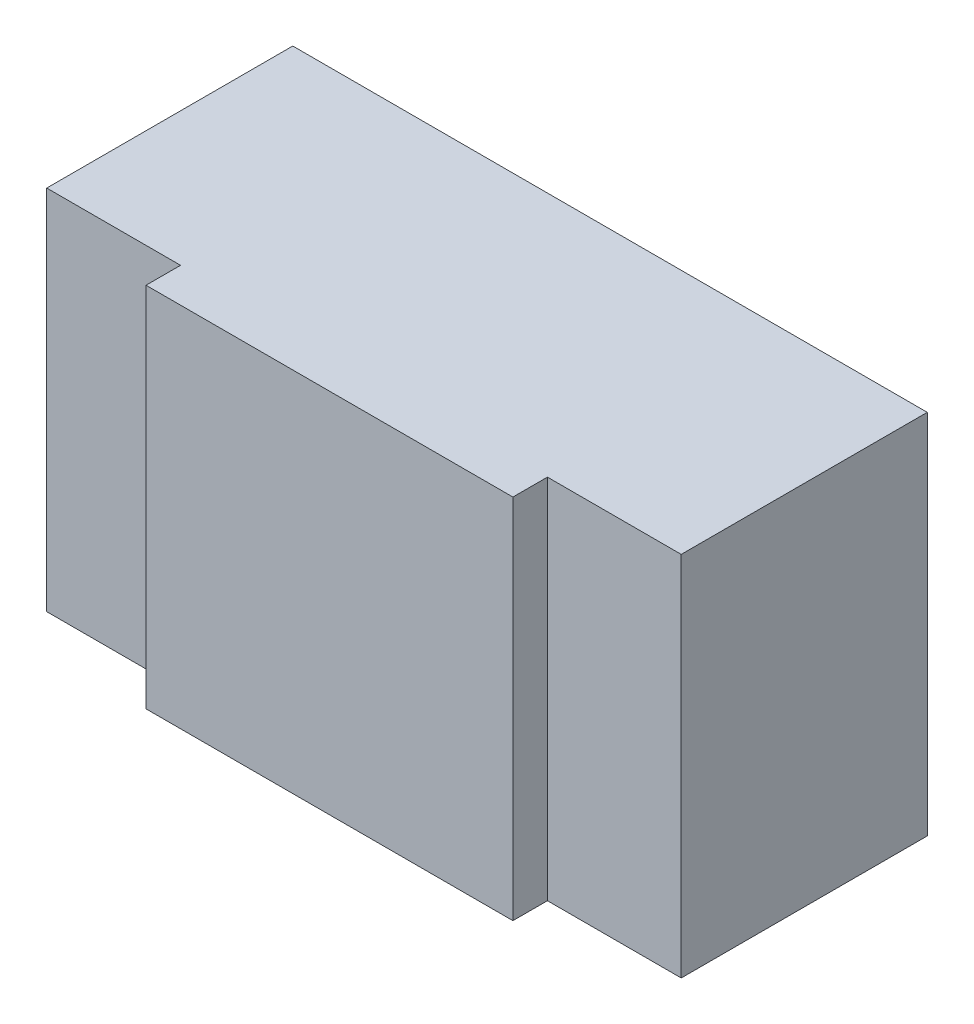
ISO-10303-21;
HEADER;
FILE_DESCRIPTION(('STEP AP214'),'2;1');
FILE_NAME('part.step','',(''),(''),'','','');
FILE_SCHEMA(('AUTOMOTIVE_DESIGN { 1 0 10303 214 1 1 1 1 }'));
ENDSEC;
DATA;
#1=APPLICATION_CONTEXT('core data for automotive mechanical design processes');
#2=APPLICATION_PROTOCOL_DEFINITION('international standard','automotive_design',2000,#1);
#3=PRODUCT_CONTEXT('',#1,'mechanical');
#4=PRODUCT('Part','Part','',(#3));
#5=PRODUCT_RELATED_PRODUCT_CATEGORY('part','',(#4));
#6=PRODUCT_DEFINITION_FORMATION('','',#4);
#7=PRODUCT_DEFINITION_CONTEXT('part definition',#1,'design');
#8=PRODUCT_DEFINITION('design','',#6,#7);
#9=PRODUCT_DEFINITION_SHAPE('','',#8);
#10=(LENGTH_UNIT() NAMED_UNIT(*) SI_UNIT(.MILLI.,.METRE.));
#11=(NAMED_UNIT(*) PLANE_ANGLE_UNIT() SI_UNIT($,.RADIAN.));
#12=(NAMED_UNIT(*) SI_UNIT($,.STERADIAN.) SOLID_ANGLE_UNIT());
#13=UNCERTAINTY_MEASURE_WITH_UNIT(LENGTH_MEASURE(1.E-05),#10,'distance_accuracy_value','');
#14=(GEOMETRIC_REPRESENTATION_CONTEXT(3) GLOBAL_UNCERTAINTY_ASSIGNED_CONTEXT((#13)) GLOBAL_UNIT_ASSIGNED_CONTEXT((#10,
#11,#12)) REPRESENTATION_CONTEXT('',''));
#15=CARTESIAN_POINT('',(0.,0.,0.));
#16=DIRECTION('',(0.,0.,1.));
#17=DIRECTION('',(1.,0.,0.));
#18=AXIS2_PLACEMENT_3D('',#15,#16,#17);
#19=CARTESIAN_POINT('',(-73.5,-42.5,57.));
#20=DIRECTION('',(1.,0.,0.));
#21=DIRECTION('',(0.,0.,-1.));
#22=AXIS2_PLACEMENT_3D('',#19,#20,#21);
#23=PLANE('',#22);
#24=DIRECTION('',(0.,-1.,0.));
#25=VECTOR('',#24,1.);
#26=CARTESIAN_POINT('',(-73.5,-42.5,0.));
#27=LINE('',#26,#25);
#28=CARTESIAN_POINT('',(-73.5,42.5,0.));
#29=VERTEX_POINT('',#28);
#30=CARTESIAN_POINT('',(-73.5,-42.5,0.));
#31=VERTEX_POINT('',#30);
#32=EDGE_CURVE('E195',#29,#31,#27,.T.);
#33=ORIENTED_EDGE('',*,*,#32,.T.);
#34=DIRECTION('',(0.,0.,-1.));
#35=VECTOR('',#34,1.);
#36=CARTESIAN_POINT('',(-73.5,-42.5,57.));
#37=LINE('',#36,#35);
#38=CARTESIAN_POINT('',(-73.5,-42.5,57.));
#39=VERTEX_POINT('',#38);
#40=EDGE_CURVE('E200',#39,#31,#37,.T.);
#41=ORIENTED_EDGE('',*,*,#40,.F.);
#42=DIRECTION('',(0.,-1.,0.));
#43=VECTOR('',#42,1.);
#44=CARTESIAN_POINT('',(-73.5,-42.5,57.));
#45=LINE('',#44,#43);
#46=CARTESIAN_POINT('',(-73.5,42.5,57.));
#47=VERTEX_POINT('',#46);
#48=EDGE_CURVE('E185',#47,#39,#45,.T.);
#49=ORIENTED_EDGE('',*,*,#48,.F.);
#50=DIRECTION('',(0.,0.,-1.));
#51=VECTOR('',#50,1.);
#52=CARTESIAN_POINT('',(-73.5,42.5,57.));
#53=LINE('',#52,#51);
#54=EDGE_CURVE('E43',#47,#29,#53,.T.);
#55=ORIENTED_EDGE('',*,*,#54,.T.);
#56=EDGE_LOOP('',(#33,#41,#49,#55));
#57=FACE_BOUND('',#56,.T.);
#58=DIRECTION('',(0.,-1.,0.));
#59=VECTOR('',#58,1.);
#60=CARTESIAN_POINT('',(-73.5,-4.5,30.));
#61=LINE('',#60,#59);
#62=CARTESIAN_POINT('',(-73.5,-4.5,30.));
#63=VERTEX_POINT('',#62);
#64=CARTESIAN_POINT('',(-73.5,-35.5,30.));
#65=VERTEX_POINT('',#64);
#66=EDGE_CURVE('E144',#63,#65,#61,.T.);
#67=ORIENTED_EDGE('',*,*,#66,.F.);
#68=DIRECTION('',(0.,0.,-1.));
#69=VECTOR('',#68,1.);
#70=CARTESIAN_POINT('',(-73.5,-4.5,30.));
#71=LINE('',#70,#69);
#72=CARTESIAN_POINT('',(-73.5,-4.5,54.));
#73=VERTEX_POINT('',#72);
#74=EDGE_CURVE('E141',#73,#63,#71,.T.);
#75=ORIENTED_EDGE('',*,*,#74,.F.);
#76=DIRECTION('',(0.,1.,0.));
#77=VECTOR('',#76,1.);
#78=CARTESIAN_POINT('',(-73.5,-4.5,54.));
#79=LINE('',#78,#77);
#80=CARTESIAN_POINT('',(-73.5,-35.5,54.));
#81=VERTEX_POINT('',#80);
#82=EDGE_CURVE('E55',#81,#73,#79,.T.);
#83=ORIENTED_EDGE('',*,*,#82,.F.);
#84=DIRECTION('',(0.,0.,1.));
#85=VECTOR('',#84,1.);
#86=CARTESIAN_POINT('',(-73.5,-35.5,30.));
#87=LINE('',#86,#85);
#88=EDGE_CURVE('E50',#65,#81,#87,.T.);
#89=ORIENTED_EDGE('',*,*,#88,.F.);
#90=EDGE_LOOP('',(#67,#75,#83,#89));
#91=FACE_BOUND('',#90,.T.);
#92=ADVANCED_FACE('F35',(#57,#91),#23,.F.);
#93=CARTESIAN_POINT('',(0.,0.,57.));
#94=DIRECTION('',(0.,0.,-1.));
#95=DIRECTION('',(-1.,0.,0.));
#96=AXIS2_PLACEMENT_3D('',#93,#94,#95);
#97=PLANE('',#96);
#98=DIRECTION('',(0.,-1.,0.));
#99=VECTOR('',#98,1.);
#100=CARTESIAN_POINT('',(-42.5,42.5,57.));
#101=LINE('',#100,#99);
#102=CARTESIAN_POINT('',(-42.5,42.5,57.));
#103=VERTEX_POINT('',#102);
#104=CARTESIAN_POINT('',(-42.5,-42.5,57.));
#105=VERTEX_POINT('',#104);
#106=EDGE_CURVE('E145',#103,#105,#101,.T.);
#107=ORIENTED_EDGE('',*,*,#106,.F.);
#108=DIRECTION('',(-1.,0.,0.));
#109=VECTOR('',#108,1.);
#110=CARTESIAN_POINT('',(-73.5,42.5,57.));
#111=LINE('',#110,#109);
#112=EDGE_CURVE('E181',#103,#47,#111,.T.);
#113=ORIENTED_EDGE('',*,*,#112,.T.);
#114=ORIENTED_EDGE('',*,*,#48,.T.);
#115=DIRECTION('',(1.,0.,0.));
#116=VECTOR('',#115,1.);
#117=CARTESIAN_POINT('',(-73.5,-42.5,57.));
#118=LINE('',#117,#116);
#119=EDGE_CURVE('E188',#39,#105,#118,.T.);
#120=ORIENTED_EDGE('',*,*,#119,.T.);
#121=EDGE_LOOP('',(#107,#113,#114,#120));
#122=FACE_BOUND('',#121,.T.);
#123=ADVANCED_FACE('F238',(#122),#97,.F.);
#124=DIRECTION('',(0.,1.,0.));
#125=VECTOR('',#124,1.);
#126=CARTESIAN_POINT('',(42.5,42.5,57.));
#127=LINE('',#126,#125);
#128=CARTESIAN_POINT('',(42.5,-42.5,57.));
#129=VERTEX_POINT('',#128);
#130=CARTESIAN_POINT('',(42.5,42.5,57.));
#131=VERTEX_POINT('',#130);
#132=EDGE_CURVE('E148',#129,#131,#127,.T.);
#133=ORIENTED_EDGE('',*,*,#132,.F.);
#134=CARTESIAN_POINT('',(73.5,-42.5,57.));
#135=VERTEX_POINT('',#134);
#136=EDGE_CURVE('E187',#129,#135,#118,.T.);
#137=ORIENTED_EDGE('',*,*,#136,.T.);
#138=DIRECTION('',(0.,1.,0.));
#139=VECTOR('',#138,1.);
#140=CARTESIAN_POINT('',(73.5,-42.5,57.));
#141=LINE('',#140,#139);
#142=CARTESIAN_POINT('',(73.5,42.5,57.));
#143=VERTEX_POINT('',#142);
#144=EDGE_CURVE('E178',#135,#143,#141,.T.);
#145=ORIENTED_EDGE('',*,*,#144,.T.);
#146=EDGE_CURVE('E183',#143,#131,#111,.T.);
#147=ORIENTED_EDGE('',*,*,#146,.T.);
#148=EDGE_LOOP('',(#133,#137,#145,#147));
#149=FACE_BOUND('',#148,.T.);
#150=ADVANCED_FACE('F223',(#149),#97,.F.);
#151=CARTESIAN_POINT('',(73.5,-42.5,57.));
#152=DIRECTION('',(-1.,0.,0.));
#153=DIRECTION('',(0.,0.,1.));
#154=AXIS2_PLACEMENT_3D('',#151,#152,#153);
#155=PLANE('',#154);
#156=DIRECTION('',(0.,1.,0.));
#157=VECTOR('',#156,1.);
#158=CARTESIAN_POINT('',(73.5,-42.5,0.));
#159=LINE('',#158,#157);
#160=CARTESIAN_POINT('',(73.5,-42.5,0.));
#161=VERTEX_POINT('',#160);
#162=CARTESIAN_POINT('',(73.5,42.5,0.));
#163=VERTEX_POINT('',#162);
#164=EDGE_CURVE('E177',#161,#163,#159,.T.);
#165=ORIENTED_EDGE('',*,*,#164,.T.);
#166=DIRECTION('',(0.,0.,-1.));
#167=VECTOR('',#166,1.);
#168=CARTESIAN_POINT('',(73.5,42.5,57.));
#169=LINE('',#168,#167);
#170=EDGE_CURVE('E11',#143,#163,#169,.T.);
#171=ORIENTED_EDGE('',*,*,#170,.F.);
#172=ORIENTED_EDGE('',*,*,#144,.F.);
#173=DIRECTION('',(0.,0.,-1.));
#174=VECTOR('',#173,1.);
#175=CARTESIAN_POINT('',(73.5,-42.5,57.));
#176=LINE('',#175,#174);
#177=EDGE_CURVE('E190',#135,#161,#176,.T.);
#178=ORIENTED_EDGE('',*,*,#177,.T.);
#179=EDGE_LOOP('',(#165,#171,#172,#178));
#180=FACE_BOUND('',#179,.T.);
#181=ADVANCED_FACE('F37',(#180),#155,.F.);
#182=CARTESIAN_POINT('',(-73.5,42.5,57.));
#183=DIRECTION('',(0.,-1.,0.));
#184=DIRECTION('',(0.,0.,-1.));
#185=AXIS2_PLACEMENT_3D('',#182,#183,#184);
#186=PLANE('',#185);
#187=DIRECTION('',(-1.,0.,0.));
#188=VECTOR('',#187,1.);
#189=CARTESIAN_POINT('',(-73.5,42.5,0.));
#190=LINE('',#189,#188);
#191=EDGE_CURVE('E193',#163,#29,#190,.T.);
#192=ORIENTED_EDGE('',*,*,#191,.T.);
#193=ORIENTED_EDGE('',*,*,#54,.F.);
#194=ORIENTED_EDGE('',*,*,#112,.F.);
#195=DIRECTION('',(0.,0.,-1.));
#196=VECTOR('',#195,1.);
#197=CARTESIAN_POINT('',(-42.5,42.5,65.));
#198=LINE('',#197,#196);
#199=CARTESIAN_POINT('',(-42.5,42.5,65.));
#200=VERTEX_POINT('',#199);
#201=EDGE_CURVE('E162',#200,#103,#198,.T.);
#202=ORIENTED_EDGE('',*,*,#201,.F.);
#203=DIRECTION('',(-1.,0.,0.));
#204=VECTOR('',#203,1.);
#205=CARTESIAN_POINT('',(-42.5,42.5,65.));
#206=LINE('',#205,#204);
#207=CARTESIAN_POINT('',(42.5,42.5,65.));
#208=VERTEX_POINT('',#207);
#209=EDGE_CURVE('E161',#208,#200,#206,.T.);
#210=ORIENTED_EDGE('',*,*,#209,.F.);
#211=DIRECTION('',(0.,0.,-1.));
#212=VECTOR('',#211,1.);
#213=CARTESIAN_POINT('',(42.5,42.5,65.));
#214=LINE('',#213,#212);
#215=EDGE_CURVE('E168',#208,#131,#214,.T.);
#216=ORIENTED_EDGE('',*,*,#215,.T.);
#217=ORIENTED_EDGE('',*,*,#146,.F.);
#218=ORIENTED_EDGE('',*,*,#170,.T.);
#219=EDGE_LOOP('',(#192,#193,#194,#202,#210,#216,#217,#218));
#220=FACE_BOUND('',#219,.T.);
#221=ADVANCED_FACE('F239',(#220),#186,.F.);
#222=CARTESIAN_POINT('',(-73.5,-42.5,57.));
#223=DIRECTION('',(0.,1.,0.));
#224=DIRECTION('',(0.,0.,1.));
#225=AXIS2_PLACEMENT_3D('',#222,#223,#224);
#226=PLANE('',#225);
#227=DIRECTION('',(1.,0.,0.));
#228=VECTOR('',#227,1.);
#229=CARTESIAN_POINT('',(-73.5,-42.5,0.));
#230=LINE('',#229,#228);
#231=EDGE_CURVE('E182',#31,#161,#230,.T.);
#232=ORIENTED_EDGE('',*,*,#231,.T.);
#233=ORIENTED_EDGE('',*,*,#177,.F.);
#234=ORIENTED_EDGE('',*,*,#136,.F.);
#235=DIRECTION('',(0.,0.,-1.));
#236=VECTOR('',#235,1.);
#237=CARTESIAN_POINT('',(42.5,-42.5,65.));
#238=LINE('',#237,#236);
#239=CARTESIAN_POINT('',(42.5,-42.5,65.));
#240=VERTEX_POINT('',#239);
#241=EDGE_CURVE('E171',#240,#129,#238,.T.);
#242=ORIENTED_EDGE('',*,*,#241,.F.);
#243=DIRECTION('',(1.,0.,0.));
#244=VECTOR('',#243,1.);
#245=CARTESIAN_POINT('',(-42.5,-42.5,65.));
#246=LINE('',#245,#244);
#247=CARTESIAN_POINT('',(-42.5,-42.5,65.));
#248=VERTEX_POINT('',#247);
#249=EDGE_CURVE('E157',#248,#240,#246,.T.);
#250=ORIENTED_EDGE('',*,*,#249,.F.);
#251=DIRECTION('',(0.,0.,-1.));
#252=VECTOR('',#251,1.);
#253=CARTESIAN_POINT('',(-42.5,-42.5,65.));
#254=LINE('',#253,#252);
#255=EDGE_CURVE('E174',#248,#105,#254,.T.);
#256=ORIENTED_EDGE('',*,*,#255,.T.);
#257=ORIENTED_EDGE('',*,*,#119,.F.);
#258=ORIENTED_EDGE('',*,*,#40,.T.);
#259=EDGE_LOOP('',(#232,#233,#234,#242,#250,#256,#257,#258));
#260=FACE_BOUND('',#259,.T.);
#261=ADVANCED_FACE('F216',(#260),#226,.F.);
#262=CARTESIAN_POINT('',(0.,0.,0.));
#263=DIRECTION('',(0.,0.,-1.));
#264=DIRECTION('',(-1.,0.,0.));
#265=AXIS2_PLACEMENT_3D('',#262,#263,#264);
#266=PLANE('',#265);
#267=ORIENTED_EDGE('',*,*,#164,.F.);
#268=ORIENTED_EDGE('',*,*,#231,.F.);
#269=ORIENTED_EDGE('',*,*,#32,.F.);
#270=ORIENTED_EDGE('',*,*,#191,.F.);
#271=EDGE_LOOP('',(#267,#268,#269,#270));
#272=FACE_BOUND('',#271,.T.);
#273=ADVANCED_FACE('F213',(#272),#266,.T.);
#274=CARTESIAN_POINT('',(-42.5,42.5,65.));
#275=DIRECTION('',(1.,0.,0.));
#276=DIRECTION('',(0.,1.,0.));
#277=AXIS2_PLACEMENT_3D('',#274,#275,#276);
#278=PLANE('',#277);
#279=ORIENTED_EDGE('',*,*,#106,.T.);
#280=ORIENTED_EDGE('',*,*,#255,.F.);
#281=DIRECTION('',(0.,-1.,0.));
#282=VECTOR('',#281,1.);
#283=CARTESIAN_POINT('',(-42.5,42.5,65.));
#284=LINE('',#283,#282);
#285=EDGE_CURVE('E154',#200,#248,#284,.T.);
#286=ORIENTED_EDGE('',*,*,#285,.F.);
#287=ORIENTED_EDGE('',*,*,#201,.T.);
#288=EDGE_LOOP('',(#279,#280,#286,#287));
#289=FACE_BOUND('',#288,.T.);
#290=ADVANCED_FACE('F236',(#289),#278,.F.);
#291=CARTESIAN_POINT('',(42.5,42.5,65.));
#292=DIRECTION('',(-1.,0.,0.));
#293=DIRECTION('',(0.,-1.,0.));
#294=AXIS2_PLACEMENT_3D('',#291,#292,#293);
#295=PLANE('',#294);
#296=ORIENTED_EDGE('',*,*,#132,.T.);
#297=ORIENTED_EDGE('',*,*,#215,.F.);
#298=DIRECTION('',(0.,1.,0.));
#299=VECTOR('',#298,1.);
#300=CARTESIAN_POINT('',(42.5,42.5,65.));
#301=LINE('',#300,#299);
#302=EDGE_CURVE('E159',#240,#208,#301,.T.);
#303=ORIENTED_EDGE('',*,*,#302,.F.);
#304=ORIENTED_EDGE('',*,*,#241,.T.);
#305=EDGE_LOOP('',(#296,#297,#303,#304));
#306=FACE_BOUND('',#305,.T.);
#307=ADVANCED_FACE('F227',(#306),#295,.F.);
#308=CARTESIAN_POINT('',(0.,0.,65.));
#309=DIRECTION('',(0.,0.,1.));
#310=DIRECTION('',(1.,0.,0.));
#311=AXIS2_PLACEMENT_3D('',#308,#309,#310);
#312=PLANE('',#311);
#313=ORIENTED_EDGE('',*,*,#285,.T.);
#314=ORIENTED_EDGE('',*,*,#249,.T.);
#315=ORIENTED_EDGE('',*,*,#302,.T.);
#316=ORIENTED_EDGE('',*,*,#209,.T.);
#317=EDGE_LOOP('',(#313,#314,#315,#316));
#318=FACE_BOUND('',#317,.T.);
#319=ADVANCED_FACE('F231',(#318),#312,.T.);
#320=CARTESIAN_POINT('',(-74.5,-4.5,30.));
#321=DIRECTION('',(0.,0.,1.));
#322=DIRECTION('',(0.,-1.,0.));
#323=AXIS2_PLACEMENT_3D('',#320,#321,#322);
#324=PLANE('',#323);
#325=ORIENTED_EDGE('',*,*,#66,.T.);
#326=DIRECTION('',(1.,0.,0.));
#327=VECTOR('',#326,1.);
#328=CARTESIAN_POINT('',(-74.5,-35.5,30.));
#329=LINE('',#328,#327);
#330=CARTESIAN_POINT('',(-74.5,-35.5,30.));
#331=VERTEX_POINT('',#330);
#332=EDGE_CURVE('E125',#331,#65,#329,.T.);
#333=ORIENTED_EDGE('',*,*,#332,.F.);
#334=DIRECTION('',(0.,-1.,0.));
#335=VECTOR('',#334,1.);
#336=CARTESIAN_POINT('',(-74.5,-4.5,30.));
#337=LINE('',#336,#335);
#338=CARTESIAN_POINT('',(-74.5,-4.5,30.));
#339=VERTEX_POINT('',#338);
#340=EDGE_CURVE('E132',#339,#331,#337,.T.);
#341=ORIENTED_EDGE('',*,*,#340,.F.);
#342=DIRECTION('',(1.,0.,0.));
#343=VECTOR('',#342,1.);
#344=CARTESIAN_POINT('',(-74.5,-4.5,30.));
#345=LINE('',#344,#343);
#346=EDGE_CURVE('E371',#339,#63,#345,.T.);
#347=ORIENTED_EDGE('',*,*,#346,.T.);
#348=EDGE_LOOP('',(#325,#333,#341,#347));
#349=FACE_BOUND('',#348,.T.);
#350=ADVANCED_FACE('F143',(#349),#324,.F.);
#351=CARTESIAN_POINT('',(-74.5,-35.5,30.));
#352=DIRECTION('',(0.,1.,0.));
#353=DIRECTION('',(0.,0.,1.));
#354=AXIS2_PLACEMENT_3D('',#351,#352,#353);
#355=PLANE('',#354);
#356=ORIENTED_EDGE('',*,*,#88,.T.);
#357=DIRECTION('',(1.,0.,0.));
#358=VECTOR('',#357,1.);
#359=CARTESIAN_POINT('',(-74.5,-35.5,54.));
#360=LINE('',#359,#358);
#361=CARTESIAN_POINT('',(-74.5,-35.5,54.));
#362=VERTEX_POINT('',#361);
#363=EDGE_CURVE('E128',#362,#81,#360,.T.);
#364=ORIENTED_EDGE('',*,*,#363,.F.);
#365=DIRECTION('',(0.,0.,1.));
#366=VECTOR('',#365,1.);
#367=CARTESIAN_POINT('',(-74.5,-35.5,30.));
#368=LINE('',#367,#366);
#369=EDGE_CURVE('E121',#331,#362,#368,.T.);
#370=ORIENTED_EDGE('',*,*,#369,.F.);
#371=ORIENTED_EDGE('',*,*,#332,.T.);
#372=EDGE_LOOP('',(#356,#364,#370,#371));
#373=FACE_BOUND('',#372,.T.);
#374=ADVANCED_FACE('F123',(#373),#355,.F.);
#375=CARTESIAN_POINT('',(-74.5,-4.5,54.));
#376=DIRECTION('',(0.,0.,-1.));
#377=DIRECTION('',(0.,1.,0.));
#378=AXIS2_PLACEMENT_3D('',#375,#376,#377);
#379=PLANE('',#378);
#380=ORIENTED_EDGE('',*,*,#82,.T.);
#381=DIRECTION('',(1.,0.,0.));
#382=VECTOR('',#381,1.);
#383=CARTESIAN_POINT('',(-74.5,-4.5,54.));
#384=LINE('',#383,#382);
#385=CARTESIAN_POINT('',(-74.5,-4.5,54.));
#386=VERTEX_POINT('',#385);
#387=EDGE_CURVE('E150',#386,#73,#384,.T.);
#388=ORIENTED_EDGE('',*,*,#387,.F.);
#389=DIRECTION('',(0.,1.,0.));
#390=VECTOR('',#389,1.);
#391=CARTESIAN_POINT('',(-74.5,-4.5,54.));
#392=LINE('',#391,#390);
#393=EDGE_CURVE('E131',#362,#386,#392,.T.);
#394=ORIENTED_EDGE('',*,*,#393,.F.);
#395=ORIENTED_EDGE('',*,*,#363,.T.);
#396=EDGE_LOOP('',(#380,#388,#394,#395));
#397=FACE_BOUND('',#396,.T.);
#398=ADVANCED_FACE('F265',(#397),#379,.F.);
#399=CARTESIAN_POINT('',(-74.5,-4.5,30.));
#400=DIRECTION('',(0.,-1.,0.));
#401=DIRECTION('',(0.,0.,-1.));
#402=AXIS2_PLACEMENT_3D('',#399,#400,#401);
#403=PLANE('',#402);
#404=ORIENTED_EDGE('',*,*,#74,.T.);
#405=ORIENTED_EDGE('',*,*,#346,.F.);
#406=DIRECTION('',(0.,0.,-1.));
#407=VECTOR('',#406,1.);
#408=CARTESIAN_POINT('',(-74.5,-4.5,30.));
#409=LINE('',#408,#407);
#410=EDGE_CURVE('E137',#386,#339,#409,.T.);
#411=ORIENTED_EDGE('',*,*,#410,.F.);
#412=ORIENTED_EDGE('',*,*,#387,.T.);
#413=EDGE_LOOP('',(#404,#405,#411,#412));
#414=FACE_BOUND('',#413,.T.);
#415=ADVANCED_FACE('F268',(#414),#403,.F.);
#416=CARTESIAN_POINT('',(-74.5,0.,0.));
#417=DIRECTION('',(-1.,0.,0.));
#418=DIRECTION('',(0.,0.,1.));
#419=AXIS2_PLACEMENT_3D('',#416,#417,#418);
#420=PLANE('',#419);
#421=ORIENTED_EDGE('',*,*,#340,.T.);
#422=ORIENTED_EDGE('',*,*,#369,.T.);
#423=ORIENTED_EDGE('',*,*,#393,.T.);
#424=ORIENTED_EDGE('',*,*,#410,.T.);
#425=EDGE_LOOP('',(#421,#422,#423,#424));
#426=FACE_BOUND('',#425,.T.);
#427=ADVANCED_FACE('F135',(#426),#420,.T.);
#428=CLOSED_SHELL('',(#92,#123,#150,#181,#221,#261,#273,#290,#307,#319,#350,#374,#398,#415,#427));
#429=MANIFOLD_SOLID_BREP('B2',#428);
#430=ADVANCED_BREP_SHAPE_REPRESENTATION('',(#18,#429),#14);
#431=SHAPE_DEFINITION_REPRESENTATION(#9,#430);
ENDSEC;
END-ISO-10303-21;
